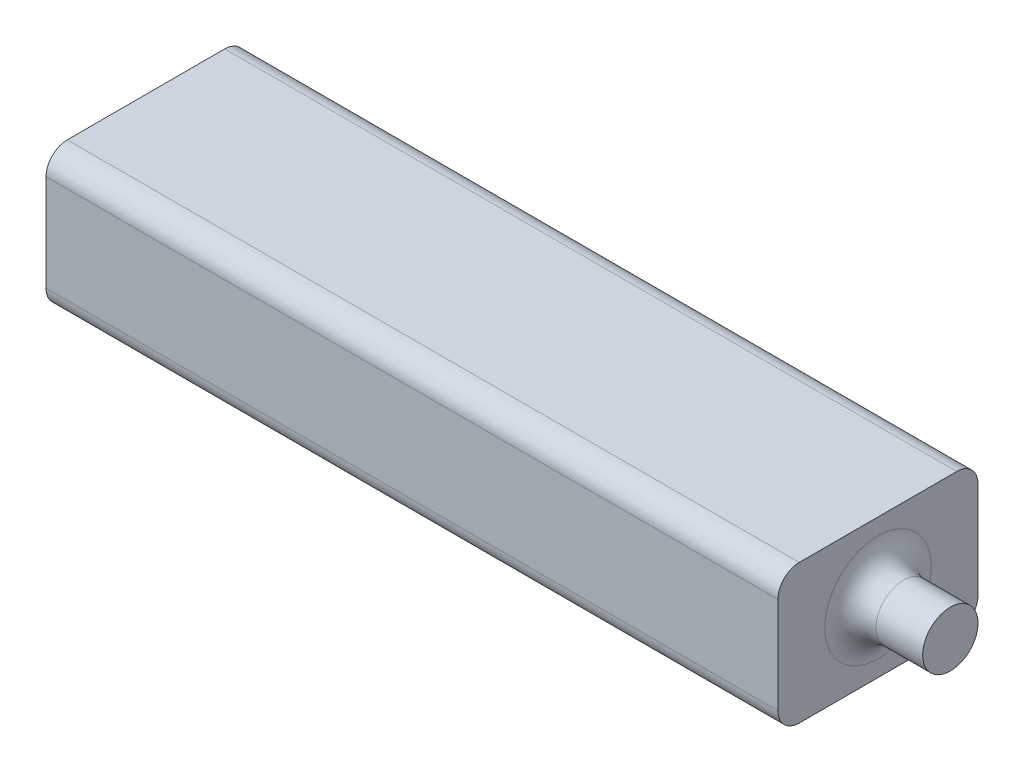
ISO-10303-21;
HEADER;
FILE_DESCRIPTION(('STEP AP214'),'2;1');
FILE_NAME('part.step','',(''),(''),'','','');
FILE_SCHEMA(('AUTOMOTIVE_DESIGN { 1 0 10303 214 1 1 1 1 }'));
ENDSEC;
DATA;
#1=APPLICATION_CONTEXT('core data for automotive mechanical design processes');
#2=APPLICATION_PROTOCOL_DEFINITION('international standard','automotive_design',2000,#1);
#3=PRODUCT_CONTEXT('',#1,'mechanical');
#4=PRODUCT('Part','Part','',(#3));
#5=PRODUCT_RELATED_PRODUCT_CATEGORY('part','',(#4));
#6=PRODUCT_DEFINITION_FORMATION('','',#4);
#7=PRODUCT_DEFINITION_CONTEXT('part definition',#1,'design');
#8=PRODUCT_DEFINITION('design','',#6,#7);
#9=PRODUCT_DEFINITION_SHAPE('','',#8);
#10=(LENGTH_UNIT() NAMED_UNIT(*) SI_UNIT(.MILLI.,.METRE.));
#11=(NAMED_UNIT(*) PLANE_ANGLE_UNIT() SI_UNIT($,.RADIAN.));
#12=(NAMED_UNIT(*) SI_UNIT($,.STERADIAN.) SOLID_ANGLE_UNIT());
#13=UNCERTAINTY_MEASURE_WITH_UNIT(LENGTH_MEASURE(1.E-05),#10,'distance_accuracy_value','');
#14=(GEOMETRIC_REPRESENTATION_CONTEXT(3) GLOBAL_UNCERTAINTY_ASSIGNED_CONTEXT((#13)) GLOBAL_UNIT_ASSIGNED_CONTEXT((#10,
#11,#12)) REPRESENTATION_CONTEXT('',''));
#15=CARTESIAN_POINT('',(0.,0.,0.));
#16=DIRECTION('',(0.,0.,1.));
#17=DIRECTION('',(1.,0.,0.));
#18=AXIS2_PLACEMENT_3D('',#15,#16,#17);
#19=CARTESIAN_POINT('',(43.,-5.675,9.25));
#20=DIRECTION('',(-1.,0.,0.));
#21=DIRECTION('',(0.,0.,1.));
#22=AXIS2_PLACEMENT_3D('',#19,#20,#21);
#23=CYLINDRICAL_SURFACE('',#22,2.5);
#24=CARTESIAN_POINT('',(-43.,-5.675,9.25));
#25=DIRECTION('',(1.,0.,0.));
#26=DIRECTION('',(0.,0.,1.));
#27=AXIS2_PLACEMENT_3D('',#24,#25,#26);
#28=CIRCLE('',#27,2.5);
#29=CARTESIAN_POINT('',(-43.,-5.675,11.75));
#30=VERTEX_POINT('',#29);
#31=CARTESIAN_POINT('',(-43.,-8.175,9.25));
#32=VERTEX_POINT('',#31);
#33=EDGE_CURVE('E276',#30,#32,#28,.T.);
#34=ORIENTED_EDGE('',*,*,#33,.T.);
#35=DIRECTION('',(-1.,0.,0.));
#36=VECTOR('',#35,1.);
#37=CARTESIAN_POINT('',(43.,-8.175,9.25));
#38=LINE('',#37,#36);
#39=CARTESIAN_POINT('',(43.,-8.175,9.25));
#40=VERTEX_POINT('',#39);
#41=EDGE_CURVE('E331',#40,#32,#38,.T.);
#42=ORIENTED_EDGE('',*,*,#41,.F.);
#43=CARTESIAN_POINT('',(43.,-5.675,9.25));
#44=DIRECTION('',(1.,0.,0.));
#45=DIRECTION('',(0.,0.,1.));
#46=AXIS2_PLACEMENT_3D('',#43,#44,#45);
#47=CIRCLE('',#46,2.5);
#48=CARTESIAN_POINT('',(43.,-5.675,11.75));
#49=VERTEX_POINT('',#48);
#50=EDGE_CURVE('E277',#49,#40,#47,.T.);
#51=ORIENTED_EDGE('',*,*,#50,.F.);
#52=DIRECTION('',(-1.,0.,0.));
#53=VECTOR('',#52,1.);
#54=CARTESIAN_POINT('',(43.,-5.675,11.75));
#55=LINE('',#54,#53);
#56=EDGE_CURVE('E295',#49,#30,#55,.T.);
#57=ORIENTED_EDGE('',*,*,#56,.T.);
#58=EDGE_LOOP('',(#34,#42,#51,#57));
#59=FACE_BOUND('',#58,.T.);
#60=ADVANCED_FACE('F36',(#59),#23,.T.);
#61=CARTESIAN_POINT('',(43.,-8.175,9.25));
#62=DIRECTION('',(0.,1.,0.));
#63=DIRECTION('',(0.,0.,1.));
#64=AXIS2_PLACEMENT_3D('',#61,#62,#63);
#65=PLANE('',#64);
#66=DIRECTION('',(0.,0.,-1.));
#67=VECTOR('',#66,1.);
#68=CARTESIAN_POINT('',(-43.,-8.175,9.25));
#69=LINE('',#68,#67);
#70=CARTESIAN_POINT('',(-43.,-8.175,-9.25));
#71=VERTEX_POINT('',#70);
#72=EDGE_CURVE('E298',#32,#71,#69,.T.);
#73=ORIENTED_EDGE('',*,*,#72,.T.);
#74=DIRECTION('',(-1.,0.,0.));
#75=VECTOR('',#74,1.);
#76=CARTESIAN_POINT('',(43.,-8.175,-9.25));
#77=LINE('',#76,#75);
#78=CARTESIAN_POINT('',(43.,-8.175,-9.25));
#79=VERTEX_POINT('',#78);
#80=EDGE_CURVE('E328',#79,#71,#77,.T.);
#81=ORIENTED_EDGE('',*,*,#80,.F.);
#82=DIRECTION('',(0.,0.,-1.));
#83=VECTOR('',#82,1.);
#84=CARTESIAN_POINT('',(43.,-8.175,9.25));
#85=LINE('',#84,#83);
#86=EDGE_CURVE('E280',#40,#79,#85,.T.);
#87=ORIENTED_EDGE('',*,*,#86,.F.);
#88=ORIENTED_EDGE('',*,*,#41,.T.);
#89=EDGE_LOOP('',(#73,#81,#87,#88));
#90=FACE_BOUND('',#89,.T.);
#91=ADVANCED_FACE('F354',(#90),#65,.F.);
#92=CARTESIAN_POINT('',(43.,-5.675,-9.25));
#93=DIRECTION('',(-1.,0.,0.));
#94=DIRECTION('',(0.,0.,1.));
#95=AXIS2_PLACEMENT_3D('',#92,#93,#94);
#96=CYLINDRICAL_SURFACE('',#95,2.5);
#97=CARTESIAN_POINT('',(-43.,-5.675,-9.25));
#98=DIRECTION('',(1.,0.,0.));
#99=DIRECTION('',(0.,0.,-1.));
#100=AXIS2_PLACEMENT_3D('',#97,#98,#99);
#101=CIRCLE('',#100,2.5);
#102=CARTESIAN_POINT('',(-43.,-5.675,-11.75));
#103=VERTEX_POINT('',#102);
#104=EDGE_CURVE('E300',#71,#103,#101,.T.);
#105=ORIENTED_EDGE('',*,*,#104,.T.);
#106=DIRECTION('',(-1.,0.,0.));
#107=VECTOR('',#106,1.);
#108=CARTESIAN_POINT('',(43.,-5.675,-11.75));
#109=LINE('',#108,#107);
#110=CARTESIAN_POINT('',(43.,-5.675,-11.75));
#111=VERTEX_POINT('',#110);
#112=EDGE_CURVE('E325',#111,#103,#109,.T.);
#113=ORIENTED_EDGE('',*,*,#112,.F.);
#114=CARTESIAN_POINT('',(43.,-5.675,-9.25));
#115=DIRECTION('',(1.,0.,0.));
#116=DIRECTION('',(0.,0.,-1.));
#117=AXIS2_PLACEMENT_3D('',#114,#115,#116);
#118=CIRCLE('',#117,2.5);
#119=EDGE_CURVE('E283',#79,#111,#118,.T.);
#120=ORIENTED_EDGE('',*,*,#119,.F.);
#121=ORIENTED_EDGE('',*,*,#80,.T.);
#122=EDGE_LOOP('',(#105,#113,#120,#121));
#123=FACE_BOUND('',#122,.T.);
#124=ADVANCED_FACE('F359',(#123),#96,.T.);
#125=CARTESIAN_POINT('',(43.,-5.675,-11.75));
#126=DIRECTION('',(0.,0.,1.));
#127=DIRECTION('',(1.,0.,0.));
#128=AXIS2_PLACEMENT_3D('',#125,#126,#127);
#129=PLANE('',#128);
#130=DIRECTION('',(-1.,0.,0.));
#131=VECTOR('',#130,1.);
#132=CARTESIAN_POINT('',(0.500000000000002,-3.925,-11.75));
#133=LINE('',#132,#131);
#134=CARTESIAN_POINT('',(0.5,-3.925,-11.75));
#135=VERTEX_POINT('',#134);
#136=CARTESIAN_POINT('',(-11.5,-3.925,-11.75));
#137=VERTEX_POINT('',#136);
#138=EDGE_CURVE('E202',#135,#137,#133,.T.);
#139=ORIENTED_EDGE('',*,*,#138,.F.);
#140=DIRECTION('',(0.,-1.,0.));
#141=VECTOR('',#140,1.);
#142=CARTESIAN_POINT('',(0.500000000000002,0.674999999999998,-11.75));
#143=LINE('',#142,#141);
#144=CARTESIAN_POINT('',(0.500000000000002,0.674999999999998,-11.75));
#145=VERTEX_POINT('',#144);
#146=EDGE_CURVE('E51',#145,#135,#143,.T.);
#147=ORIENTED_EDGE('',*,*,#146,.F.);
#148=DIRECTION('',(1.,0.,0.));
#149=VECTOR('',#148,1.);
#150=CARTESIAN_POINT('',(0.500000000000002,0.674999999999998,-11.75));
#151=LINE('',#150,#149);
#152=CARTESIAN_POINT('',(-11.5,0.675000000000001,-11.75));
#153=VERTEX_POINT('',#152);
#154=EDGE_CURVE('E193',#153,#145,#151,.T.);
#155=ORIENTED_EDGE('',*,*,#154,.F.);
#156=DIRECTION('',(0.,1.,0.));
#157=VECTOR('',#156,1.);
#158=CARTESIAN_POINT('',(-11.5,0.675000000000001,-11.75));
#159=LINE('',#158,#157);
#160=EDGE_CURVE('E196',#137,#153,#159,.T.);
#161=ORIENTED_EDGE('',*,*,#160,.F.);
#162=EDGE_LOOP('',(#139,#147,#155,#161));
#163=FACE_BOUND('',#162,.T.);
#164=DIRECTION('',(1.,0.,0.));
#165=VECTOR('',#164,1.);
#166=CARTESIAN_POINT('',(6.,0.674999999999998,-11.75));
#167=LINE('',#166,#165);
#168=CARTESIAN_POINT('',(6.00000000000001,0.674999999999999,-11.75));
#169=VERTEX_POINT('',#168);
#170=CARTESIAN_POINT('',(18.,0.674999999999997,-11.75));
#171=VERTEX_POINT('',#170);
#172=EDGE_CURVE('E228',#169,#171,#167,.T.);
#173=ORIENTED_EDGE('',*,*,#172,.F.);
#174=DIRECTION('',(0.,1.,0.));
#175=VECTOR('',#174,1.);
#176=CARTESIAN_POINT('',(6.,0.674999999999998,-11.75));
#177=LINE('',#176,#175);
#178=CARTESIAN_POINT('',(6.,-3.925,-11.75));
#179=VERTEX_POINT('',#178);
#180=EDGE_CURVE('E59',#179,#169,#177,.T.);
#181=ORIENTED_EDGE('',*,*,#180,.F.);
#182=DIRECTION('',(-1.,0.,0.));
#183=VECTOR('',#182,1.);
#184=CARTESIAN_POINT('',(6.,-3.925,-11.75));
#185=LINE('',#184,#183);
#186=CARTESIAN_POINT('',(18.,-3.925,-11.75));
#187=VERTEX_POINT('',#186);
#188=EDGE_CURVE('E217',#187,#179,#185,.T.);
#189=ORIENTED_EDGE('',*,*,#188,.F.);
#190=DIRECTION('',(0.,-1.,0.));
#191=VECTOR('',#190,1.);
#192=CARTESIAN_POINT('',(18.,0.674999999999997,-11.75));
#193=LINE('',#192,#191);
#194=EDGE_CURVE('E232',#171,#187,#193,.T.);
#195=ORIENTED_EDGE('',*,*,#194,.F.);
#196=EDGE_LOOP('',(#173,#181,#189,#195));
#197=FACE_BOUND('',#196,.T.);
#198=DIRECTION('',(1.,0.,0.));
#199=VECTOR('',#198,1.);
#200=CARTESIAN_POINT('',(23.5,0.674999999999996,-11.75));
#201=LINE('',#200,#199);
#202=CARTESIAN_POINT('',(23.5,0.674999999999997,-11.75));
#203=VERTEX_POINT('',#202);
#204=CARTESIAN_POINT('',(35.5,0.674999999999995,-11.75));
#205=VERTEX_POINT('',#204);
#206=EDGE_CURVE('E259',#203,#205,#201,.T.);
#207=ORIENTED_EDGE('',*,*,#206,.F.);
#208=DIRECTION('',(0.,1.,0.));
#209=VECTOR('',#208,1.);
#210=CARTESIAN_POINT('',(23.5,0.674999999999996,-11.75));
#211=LINE('',#210,#209);
#212=CARTESIAN_POINT('',(23.5,-3.925,-11.75));
#213=VERTEX_POINT('',#212);
#214=EDGE_CURVE('E257',#213,#203,#211,.T.);
#215=ORIENTED_EDGE('',*,*,#214,.F.);
#216=DIRECTION('',(-1.,0.,0.));
#217=VECTOR('',#216,1.);
#218=CARTESIAN_POINT('',(23.5,-3.925,-11.75));
#219=LINE('',#218,#217);
#220=CARTESIAN_POINT('',(35.5,-3.925,-11.75));
#221=VERTEX_POINT('',#220);
#222=EDGE_CURVE('E247',#221,#213,#219,.T.);
#223=ORIENTED_EDGE('',*,*,#222,.F.);
#224=DIRECTION('',(0.,-1.,0.));
#225=VECTOR('',#224,1.);
#226=CARTESIAN_POINT('',(35.5,0.674999999999995,-11.75));
#227=LINE('',#226,#225);
#228=EDGE_CURVE('E262',#205,#221,#227,.T.);
#229=ORIENTED_EDGE('',*,*,#228,.F.);
#230=EDGE_LOOP('',(#207,#215,#223,#229));
#231=FACE_BOUND('',#230,.T.);
#232=DIRECTION('',(0.,1.,0.));
#233=VECTOR('',#232,1.);
#234=CARTESIAN_POINT('',(-43.,-5.675,-11.75));
#235=LINE('',#234,#233);
#236=CARTESIAN_POINT('',(-43.,5.675,-11.75));
#237=VERTEX_POINT('',#236);
#238=EDGE_CURVE('E302',#103,#237,#235,.T.);
#239=ORIENTED_EDGE('',*,*,#238,.T.);
#240=DIRECTION('',(-1.,0.,0.));
#241=VECTOR('',#240,1.);
#242=CARTESIAN_POINT('',(43.,5.675,-11.75));
#243=LINE('',#242,#241);
#244=CARTESIAN_POINT('',(43.,5.675,-11.75));
#245=VERTEX_POINT('',#244);
#246=EDGE_CURVE('E322',#245,#237,#243,.T.);
#247=ORIENTED_EDGE('',*,*,#246,.F.);
#248=DIRECTION('',(0.,1.,0.));
#249=VECTOR('',#248,1.);
#250=CARTESIAN_POINT('',(43.,-5.675,-11.75));
#251=LINE('',#250,#249);
#252=EDGE_CURVE('E285',#111,#245,#251,.T.);
#253=ORIENTED_EDGE('',*,*,#252,.F.);
#254=ORIENTED_EDGE('',*,*,#112,.T.);
#255=EDGE_LOOP('',(#239,#247,#253,#254));
#256=FACE_BOUND('',#255,.T.);
#257=ADVANCED_FACE('F365',(#163,#197,#231,#256),#129,.F.);
#258=CARTESIAN_POINT('',(43.,5.675,-9.25));
#259=DIRECTION('',(-1.,0.,0.));
#260=DIRECTION('',(0.,0.,1.));
#261=AXIS2_PLACEMENT_3D('',#258,#259,#260);
#262=CYLINDRICAL_SURFACE('',#261,2.5);
#263=CARTESIAN_POINT('',(-43.,5.675,-9.25));
#264=DIRECTION('',(1.,0.,0.));
#265=DIRECTION('',(0.,0.,1.));
#266=AXIS2_PLACEMENT_3D('',#263,#264,#265);
#267=CIRCLE('',#266,2.5);
#268=CARTESIAN_POINT('',(-43.,8.175,-9.25));
#269=VERTEX_POINT('',#268);
#270=EDGE_CURVE('E304',#237,#269,#267,.T.);
#271=ORIENTED_EDGE('',*,*,#270,.T.);
#272=DIRECTION('',(-1.,0.,0.));
#273=VECTOR('',#272,1.);
#274=CARTESIAN_POINT('',(43.,8.175,-9.25));
#275=LINE('',#274,#273);
#276=CARTESIAN_POINT('',(43.,8.175,-9.25));
#277=VERTEX_POINT('',#276);
#278=EDGE_CURVE('E319',#277,#269,#275,.T.);
#279=ORIENTED_EDGE('',*,*,#278,.F.);
#280=CARTESIAN_POINT('',(43.,5.675,-9.25));
#281=DIRECTION('',(1.,0.,0.));
#282=DIRECTION('',(0.,0.,1.));
#283=AXIS2_PLACEMENT_3D('',#280,#281,#282);
#284=CIRCLE('',#283,2.5);
#285=EDGE_CURVE('E287',#245,#277,#284,.T.);
#286=ORIENTED_EDGE('',*,*,#285,.F.);
#287=ORIENTED_EDGE('',*,*,#246,.T.);
#288=EDGE_LOOP('',(#271,#279,#286,#287));
#289=FACE_BOUND('',#288,.T.);
#290=ADVANCED_FACE('F369',(#289),#262,.T.);
#291=CARTESIAN_POINT('',(43.,8.175,9.25));
#292=DIRECTION('',(0.,-1.,0.));
#293=DIRECTION('',(0.,0.,-1.));
#294=AXIS2_PLACEMENT_3D('',#291,#292,#293);
#295=PLANE('',#294);
#296=DIRECTION('',(0.,0.,1.));
#297=VECTOR('',#296,1.);
#298=CARTESIAN_POINT('',(-43.,8.175,9.25));
#299=LINE('',#298,#297);
#300=CARTESIAN_POINT('',(-43.,8.175,9.25));
#301=VERTEX_POINT('',#300);
#302=EDGE_CURVE('E306',#269,#301,#299,.T.);
#303=ORIENTED_EDGE('',*,*,#302,.T.);
#304=DIRECTION('',(-1.,0.,0.));
#305=VECTOR('',#304,1.);
#306=CARTESIAN_POINT('',(43.,8.175,9.25));
#307=LINE('',#306,#305);
#308=CARTESIAN_POINT('',(43.,8.175,9.25));
#309=VERTEX_POINT('',#308);
#310=EDGE_CURVE('E316',#309,#301,#307,.T.);
#311=ORIENTED_EDGE('',*,*,#310,.F.);
#312=DIRECTION('',(0.,0.,1.));
#313=VECTOR('',#312,1.);
#314=CARTESIAN_POINT('',(43.,8.175,9.25));
#315=LINE('',#314,#313);
#316=EDGE_CURVE('E289',#277,#309,#315,.T.);
#317=ORIENTED_EDGE('',*,*,#316,.F.);
#318=ORIENTED_EDGE('',*,*,#278,.T.);
#319=EDGE_LOOP('',(#303,#311,#317,#318));
#320=FACE_BOUND('',#319,.T.);
#321=ADVANCED_FACE('F373',(#320),#295,.F.);
#322=CARTESIAN_POINT('',(43.,5.675,9.25));
#323=DIRECTION('',(-1.,0.,0.));
#324=DIRECTION('',(0.,0.,1.));
#325=AXIS2_PLACEMENT_3D('',#322,#323,#324);
#326=CYLINDRICAL_SURFACE('',#325,2.5);
#327=CARTESIAN_POINT('',(-43.,5.675,9.25));
#328=DIRECTION('',(1.,0.,0.));
#329=DIRECTION('',(0.,0.,1.));
#330=AXIS2_PLACEMENT_3D('',#327,#328,#329);
#331=CIRCLE('',#330,2.5);
#332=CARTESIAN_POINT('',(-43.,5.675,11.75));
#333=VERTEX_POINT('',#332);
#334=EDGE_CURVE('E308',#301,#333,#331,.T.);
#335=ORIENTED_EDGE('',*,*,#334,.T.);
#336=DIRECTION('',(-1.,0.,0.));
#337=VECTOR('',#336,1.);
#338=CARTESIAN_POINT('',(43.,5.675,11.75));
#339=LINE('',#338,#337);
#340=CARTESIAN_POINT('',(43.,5.675,11.75));
#341=VERTEX_POINT('',#340);
#342=EDGE_CURVE('E313',#341,#333,#339,.T.);
#343=ORIENTED_EDGE('',*,*,#342,.F.);
#344=CARTESIAN_POINT('',(43.,5.675,9.25));
#345=DIRECTION('',(1.,0.,0.));
#346=DIRECTION('',(0.,0.,1.));
#347=AXIS2_PLACEMENT_3D('',#344,#345,#346);
#348=CIRCLE('',#347,2.5);
#349=EDGE_CURVE('E291',#309,#341,#348,.T.);
#350=ORIENTED_EDGE('',*,*,#349,.F.);
#351=ORIENTED_EDGE('',*,*,#310,.T.);
#352=EDGE_LOOP('',(#335,#343,#350,#351));
#353=FACE_BOUND('',#352,.T.);
#354=ADVANCED_FACE('F377',(#353),#326,.T.);
#355=CARTESIAN_POINT('',(43.,-5.675,11.75));
#356=DIRECTION('',(0.,0.,-1.));
#357=DIRECTION('',(-1.,0.,0.));
#358=AXIS2_PLACEMENT_3D('',#355,#356,#357);
#359=PLANE('',#358);
#360=DIRECTION('',(0.,-1.,0.));
#361=VECTOR('',#360,1.);
#362=CARTESIAN_POINT('',(-43.,-5.675,11.75));
#363=LINE('',#362,#361);
#364=EDGE_CURVE('E281',#333,#30,#363,.T.);
#365=ORIENTED_EDGE('',*,*,#364,.T.);
#366=ORIENTED_EDGE('',*,*,#56,.F.);
#367=DIRECTION('',(0.,-1.,0.));
#368=VECTOR('',#367,1.);
#369=CARTESIAN_POINT('',(43.,-5.675,11.75));
#370=LINE('',#369,#368);
#371=EDGE_CURVE('E293',#341,#49,#370,.T.);
#372=ORIENTED_EDGE('',*,*,#371,.F.);
#373=ORIENTED_EDGE('',*,*,#342,.T.);
#374=EDGE_LOOP('',(#365,#366,#372,#373));
#375=FACE_BOUND('',#374,.T.);
#376=ADVANCED_FACE('F381',(#375),#359,.F.);
#377=CARTESIAN_POINT('',(43.,-5.675,9.25));
#378=DIRECTION('',(-1.,0.,0.));
#379=DIRECTION('',(0.,0.,1.));
#380=AXIS2_PLACEMENT_3D('',#377,#378,#379);
#381=PLANE('',#380);
#382=CARTESIAN_POINT('',(43.,0.,0.));
#383=DIRECTION('',(-1.,0.,0.));
#384=DIRECTION('',(0.,0.,1.));
#385=AXIS2_PLACEMENT_3D('',#382,#383,#384);
#386=CIRCLE('',#385,6.25);
#387=CARTESIAN_POINT('',(43.,0.,6.25));
#388=VERTEX_POINT('',#387);
#389=EDGE_CURVE('E11',#388,#388,#386,.T.);
#390=ORIENTED_EDGE('',*,*,#389,.T.);
#391=EDGE_LOOP('',(#390));
#392=FACE_BOUND('',#391,.T.);
#393=ORIENTED_EDGE('',*,*,#50,.T.);
#394=ORIENTED_EDGE('',*,*,#86,.T.);
#395=ORIENTED_EDGE('',*,*,#119,.T.);
#396=ORIENTED_EDGE('',*,*,#252,.T.);
#397=ORIENTED_EDGE('',*,*,#285,.T.);
#398=ORIENTED_EDGE('',*,*,#316,.T.);
#399=ORIENTED_EDGE('',*,*,#349,.T.);
#400=ORIENTED_EDGE('',*,*,#371,.T.);
#401=EDGE_LOOP('',(#393,#394,#395,#396,#397,#398,#399,#400));
#402=FACE_BOUND('',#401,.T.);
#403=ADVANCED_FACE('F385',(#392,#402),#381,.F.);
#404=CARTESIAN_POINT('',(-43.,-5.675,9.25));
#405=DIRECTION('',(-1.,0.,0.));
#406=DIRECTION('',(0.,0.,1.));
#407=AXIS2_PLACEMENT_3D('',#404,#405,#406);
#408=PLANE('',#407);
#409=ORIENTED_EDGE('',*,*,#33,.F.);
#410=ORIENTED_EDGE('',*,*,#364,.F.);
#411=ORIENTED_EDGE('',*,*,#334,.F.);
#412=ORIENTED_EDGE('',*,*,#302,.F.);
#413=ORIENTED_EDGE('',*,*,#270,.F.);
#414=ORIENTED_EDGE('',*,*,#238,.F.);
#415=ORIENTED_EDGE('',*,*,#104,.F.);
#416=ORIENTED_EDGE('',*,*,#72,.F.);
#417=EDGE_LOOP('',(#409,#410,#411,#412,#413,#414,#415,#416));
#418=FACE_BOUND('',#417,.T.);
#419=ADVANCED_FACE('F387',(#418),#408,.T.);
#420=CARTESIAN_POINT('',(51.5,0.,0.));
#421=DIRECTION('',(-1.,0.,0.));
#422=DIRECTION('',(0.,0.,1.));
#423=AXIS2_PLACEMENT_3D('',#420,#421,#422);
#424=CYLINDRICAL_SURFACE('',#423,3.25);
#425=CARTESIAN_POINT('',(46.,0.,0.));
#426=DIRECTION('',(-1.,0.,0.));
#427=DIRECTION('',(0.,0.,1.));
#428=AXIS2_PLACEMENT_3D('',#425,#426,#427);
#429=CIRCLE('',#428,3.25);
#430=CARTESIAN_POINT('',(46.,0.,3.25));
#431=VERTEX_POINT('',#430);
#432=EDGE_CURVE('E44',#431,#431,#429,.F.);
#433=ORIENTED_EDGE('',*,*,#432,.T.);
#434=EDGE_LOOP('',(#433));
#435=FACE_BOUND('',#434,.T.);
#436=CARTESIAN_POINT('',(51.5,0.,0.));
#437=DIRECTION('',(1.,0.,0.));
#438=DIRECTION('',(0.,0.,-1.));
#439=AXIS2_PLACEMENT_3D('',#436,#437,#438);
#440=CIRCLE('',#439,3.25);
#441=CARTESIAN_POINT('',(51.5,0.,-3.25));
#442=VERTEX_POINT('',#441);
#443=EDGE_CURVE('E209',#442,#442,#440,.T.);
#444=ORIENTED_EDGE('',*,*,#443,.F.);
#445=EDGE_LOOP('',(#444));
#446=FACE_BOUND('',#445,.T.);
#447=ADVANCED_FACE('F336',(#435,#446),#424,.T.);
#448=CARTESIAN_POINT('',(51.5,0.,0.));
#449=DIRECTION('',(1.,0.,0.));
#450=DIRECTION('',(0.,0.,-1.));
#451=AXIS2_PLACEMENT_3D('',#448,#449,#450);
#452=PLANE('',#451);
#453=ORIENTED_EDGE('',*,*,#443,.T.);
#454=EDGE_LOOP('',(#453));
#455=FACE_BOUND('',#454,.T.);
#456=ADVANCED_FACE('F341',(#455),#452,.T.);
#457=CARTESIAN_POINT('',(46.,0.,0.));
#458=DIRECTION('',(-1.,0.,0.));
#459=DIRECTION('',(0.,0.,1.));
#460=AXIS2_PLACEMENT_3D('',#457,#458,#459);
#461=TOROIDAL_SURFACE('',#460,6.25,3.);
#462=ORIENTED_EDGE('',*,*,#389,.F.);
#463=EDGE_LOOP('',(#462));
#464=FACE_BOUND('',#463,.T.);
#465=ORIENTED_EDGE('',*,*,#432,.F.);
#466=EDGE_LOOP('',(#465));
#467=FACE_BOUND('',#466,.T.);
#468=ADVANCED_FACE('F38',(#464,#467),#461,.F.);
#469=CARTESIAN_POINT('',(23.5,0.674999999999996,-6.75));
#470=DIRECTION('',(-1.,0.,0.));
#471=DIRECTION('',(0.,0.,1.));
#472=AXIS2_PLACEMENT_3D('',#469,#470,#471);
#473=PLANE('',#472);
#474=ORIENTED_EDGE('',*,*,#214,.T.);
#475=DIRECTION('',(0.,0.,-1.));
#476=VECTOR('',#475,1.);
#477=CARTESIAN_POINT('',(23.5,0.674999999999996,-6.75));
#478=LINE('',#477,#476);
#479=CARTESIAN_POINT('',(23.5,0.674999999999996,-6.75));
#480=VERTEX_POINT('',#479);
#481=EDGE_CURVE('E256',#480,#203,#478,.T.);
#482=ORIENTED_EDGE('',*,*,#481,.F.);
#483=DIRECTION('',(0.,1.,0.));
#484=VECTOR('',#483,1.);
#485=CARTESIAN_POINT('',(23.5,0.674999999999996,-6.75));
#486=LINE('',#485,#484);
#487=CARTESIAN_POINT('',(23.5,-3.925,-6.75));
#488=VERTEX_POINT('',#487);
#489=EDGE_CURVE('E243',#488,#480,#486,.T.);
#490=ORIENTED_EDGE('',*,*,#489,.F.);
#491=DIRECTION('',(0.,0.,-1.));
#492=VECTOR('',#491,1.);
#493=CARTESIAN_POINT('',(23.5,-3.925,-6.75));
#494=LINE('',#493,#492);
#495=EDGE_CURVE('E229',#488,#213,#494,.T.);
#496=ORIENTED_EDGE('',*,*,#495,.T.);
#497=EDGE_LOOP('',(#474,#482,#490,#496));
#498=FACE_BOUND('',#497,.T.);
#499=ADVANCED_FACE('F340',(#498),#473,.F.);
#500=CARTESIAN_POINT('',(23.5,-3.925,-6.75));
#501=DIRECTION('',(0.,-1.,0.));
#502=DIRECTION('',(1.,0.,0.));
#503=AXIS2_PLACEMENT_3D('',#500,#501,#502);
#504=PLANE('',#503);
#505=ORIENTED_EDGE('',*,*,#222,.T.);
#506=ORIENTED_EDGE('',*,*,#495,.F.);
#507=DIRECTION('',(-1.,0.,0.));
#508=VECTOR('',#507,1.);
#509=CARTESIAN_POINT('',(23.5,-3.925,-6.75));
#510=LINE('',#509,#508);
#511=CARTESIAN_POINT('',(35.5,-3.925,-6.75));
#512=VERTEX_POINT('',#511);
#513=EDGE_CURVE('E253',#512,#488,#510,.T.);
#514=ORIENTED_EDGE('',*,*,#513,.F.);
#515=DIRECTION('',(0.,0.,-1.));
#516=VECTOR('',#515,1.);
#517=CARTESIAN_POINT('',(35.5,-3.925,-6.75));
#518=LINE('',#517,#516);
#519=EDGE_CURVE('E268',#512,#221,#518,.T.);
#520=ORIENTED_EDGE('',*,*,#519,.T.);
#521=EDGE_LOOP('',(#505,#506,#514,#520));
#522=FACE_BOUND('',#521,.T.);
#523=ADVANCED_FACE('F347',(#522),#504,.F.);
#524=CARTESIAN_POINT('',(35.5,0.674999999999995,-6.75));
#525=DIRECTION('',(1.,0.,0.));
#526=DIRECTION('',(0.,0.,-1.));
#527=AXIS2_PLACEMENT_3D('',#524,#525,#526);
#528=PLANE('',#527);
#529=ORIENTED_EDGE('',*,*,#228,.T.);
#530=ORIENTED_EDGE('',*,*,#519,.F.);
#531=DIRECTION('',(0.,-1.,0.));
#532=VECTOR('',#531,1.);
#533=CARTESIAN_POINT('',(35.5,0.674999999999995,-6.75));
#534=LINE('',#533,#532);
#535=CARTESIAN_POINT('',(35.5,0.674999999999995,-6.75));
#536=VERTEX_POINT('',#535);
#537=EDGE_CURVE('E250',#536,#512,#534,.T.);
#538=ORIENTED_EDGE('',*,*,#537,.F.);
#539=DIRECTION('',(0.,0.,-1.));
#540=VECTOR('',#539,1.);
#541=CARTESIAN_POINT('',(35.5,0.674999999999995,-6.75));
#542=LINE('',#541,#540);
#543=EDGE_CURVE('E270',#536,#205,#542,.T.);
#544=ORIENTED_EDGE('',*,*,#543,.T.);
#545=EDGE_LOOP('',(#529,#530,#538,#544));
#546=FACE_BOUND('',#545,.T.);
#547=ADVANCED_FACE('F400',(#546),#528,.F.);
#548=CARTESIAN_POINT('',(23.5,0.674999999999996,-6.75));
#549=DIRECTION('',(0.,1.,0.));
#550=DIRECTION('',(-1.,0.,0.));
#551=AXIS2_PLACEMENT_3D('',#548,#549,#550);
#552=PLANE('',#551);
#553=ORIENTED_EDGE('',*,*,#206,.T.);
#554=ORIENTED_EDGE('',*,*,#543,.F.);
#555=DIRECTION('',(1.,0.,0.));
#556=VECTOR('',#555,1.);
#557=CARTESIAN_POINT('',(23.5,0.674999999999996,-6.75));
#558=LINE('',#557,#556);
#559=EDGE_CURVE('E246',#480,#536,#558,.T.);
#560=ORIENTED_EDGE('',*,*,#559,.F.);
#561=ORIENTED_EDGE('',*,*,#481,.T.);
#562=EDGE_LOOP('',(#553,#554,#560,#561));
#563=FACE_BOUND('',#562,.T.);
#564=ADVANCED_FACE('F396',(#563),#552,.F.);
#565=CARTESIAN_POINT('',(0.,0.,-6.75));
#566=DIRECTION('',(0.,0.,1.));
#567=DIRECTION('',(1.,0.,0.));
#568=AXIS2_PLACEMENT_3D('',#565,#566,#567);
#569=PLANE('',#568);
#570=ORIENTED_EDGE('',*,*,#489,.T.);
#571=ORIENTED_EDGE('',*,*,#559,.T.);
#572=ORIENTED_EDGE('',*,*,#537,.T.);
#573=ORIENTED_EDGE('',*,*,#513,.T.);
#574=EDGE_LOOP('',(#570,#571,#572,#573));
#575=FACE_BOUND('',#574,.T.);
#576=ADVANCED_FACE('F399',(#575),#569,.F.);
#577=CARTESIAN_POINT('',(6.,0.674999999999998,-6.75));
#578=DIRECTION('',(-1.,0.,0.));
#579=DIRECTION('',(0.,-1.,0.));
#580=AXIS2_PLACEMENT_3D('',#577,#578,#579);
#581=PLANE('',#580);
#582=ORIENTED_EDGE('',*,*,#180,.T.);
#583=DIRECTION('',(0.,0.,-1.));
#584=VECTOR('',#583,1.);
#585=CARTESIAN_POINT('',(6.,0.674999999999998,-6.75));
#586=LINE('',#585,#584);
#587=CARTESIAN_POINT('',(6.,0.674999999999998,-6.75));
#588=VERTEX_POINT('',#587);
#589=EDGE_CURVE('E226',#588,#169,#586,.T.);
#590=ORIENTED_EDGE('',*,*,#589,.F.);
#591=DIRECTION('',(0.,1.,0.));
#592=VECTOR('',#591,1.);
#593=CARTESIAN_POINT('',(6.,0.674999999999998,-6.75));
#594=LINE('',#593,#592);
#595=CARTESIAN_POINT('',(6.,-3.925,-6.75));
#596=VERTEX_POINT('',#595);
#597=EDGE_CURVE('E213',#596,#588,#594,.T.);
#598=ORIENTED_EDGE('',*,*,#597,.F.);
#599=DIRECTION('',(0.,0.,-1.));
#600=VECTOR('',#599,1.);
#601=CARTESIAN_POINT('',(6.,-3.925,-6.75));
#602=LINE('',#601,#600);
#603=EDGE_CURVE('E203',#596,#179,#602,.T.);
#604=ORIENTED_EDGE('',*,*,#603,.T.);
#605=EDGE_LOOP('',(#582,#590,#598,#604));
#606=FACE_BOUND('',#605,.T.);
#607=ADVANCED_FACE('F410',(#606),#581,.F.);
#608=CARTESIAN_POINT('',(6.,-3.925,-6.75));
#609=DIRECTION('',(0.,-1.,0.));
#610=DIRECTION('',(1.,0.,0.));
#611=AXIS2_PLACEMENT_3D('',#608,#609,#610);
#612=PLANE('',#611);
#613=ORIENTED_EDGE('',*,*,#188,.T.);
#614=ORIENTED_EDGE('',*,*,#603,.F.);
#615=DIRECTION('',(-1.,0.,0.));
#616=VECTOR('',#615,1.);
#617=CARTESIAN_POINT('',(6.,-3.925,-6.75));
#618=LINE('',#617,#616);
#619=CARTESIAN_POINT('',(18.,-3.925,-6.75));
#620=VERTEX_POINT('',#619);
#621=EDGE_CURVE('E223',#620,#596,#618,.T.);
#622=ORIENTED_EDGE('',*,*,#621,.F.);
#623=DIRECTION('',(0.,0.,-1.));
#624=VECTOR('',#623,1.);
#625=CARTESIAN_POINT('',(18.,-3.925,-6.75));
#626=LINE('',#625,#624);
#627=EDGE_CURVE('E238',#620,#187,#626,.T.);
#628=ORIENTED_EDGE('',*,*,#627,.T.);
#629=EDGE_LOOP('',(#613,#614,#622,#628));
#630=FACE_BOUND('',#629,.T.);
#631=ADVANCED_FACE('F414',(#630),#612,.F.);
#632=CARTESIAN_POINT('',(18.,0.674999999999997,-6.75));
#633=DIRECTION('',(1.,0.,0.));
#634=DIRECTION('',(0.,0.,-1.));
#635=AXIS2_PLACEMENT_3D('',#632,#633,#634);
#636=PLANE('',#635);
#637=ORIENTED_EDGE('',*,*,#194,.T.);
#638=ORIENTED_EDGE('',*,*,#627,.F.);
#639=DIRECTION('',(0.,-1.,0.));
#640=VECTOR('',#639,1.);
#641=CARTESIAN_POINT('',(18.,0.674999999999997,-6.75));
#642=LINE('',#641,#640);
#643=CARTESIAN_POINT('',(18.,0.674999999999997,-6.75));
#644=VERTEX_POINT('',#643);
#645=EDGE_CURVE('E220',#644,#620,#642,.T.);
#646=ORIENTED_EDGE('',*,*,#645,.F.);
#647=DIRECTION('',(0.,0.,-1.));
#648=VECTOR('',#647,1.);
#649=CARTESIAN_POINT('',(18.,0.674999999999997,-6.75));
#650=LINE('',#649,#648);
#651=EDGE_CURVE('E240',#644,#171,#650,.T.);
#652=ORIENTED_EDGE('',*,*,#651,.T.);
#653=EDGE_LOOP('',(#637,#638,#646,#652));
#654=FACE_BOUND('',#653,.T.);
#655=ADVANCED_FACE('F419',(#654),#636,.F.);
#656=CARTESIAN_POINT('',(6.,0.674999999999998,-6.75));
#657=DIRECTION('',(0.,1.,0.));
#658=DIRECTION('',(-1.,0.,0.));
#659=AXIS2_PLACEMENT_3D('',#656,#657,#658);
#660=PLANE('',#659);
#661=ORIENTED_EDGE('',*,*,#172,.T.);
#662=ORIENTED_EDGE('',*,*,#651,.F.);
#663=DIRECTION('',(1.,0.,0.));
#664=VECTOR('',#663,1.);
#665=CARTESIAN_POINT('',(6.,0.674999999999998,-6.75));
#666=LINE('',#665,#664);
#667=EDGE_CURVE('E216',#588,#644,#666,.T.);
#668=ORIENTED_EDGE('',*,*,#667,.F.);
#669=ORIENTED_EDGE('',*,*,#589,.T.);
#670=EDGE_LOOP('',(#661,#662,#668,#669));
#671=FACE_BOUND('',#670,.T.);
#672=ADVANCED_FACE('F415',(#671),#660,.F.);
#673=CARTESIAN_POINT('',(0.,0.,-6.75));
#674=DIRECTION('',(0.,0.,1.));
#675=DIRECTION('',(1.,0.,0.));
#676=AXIS2_PLACEMENT_3D('',#673,#674,#675);
#677=PLANE('',#676);
#678=ORIENTED_EDGE('',*,*,#597,.T.);
#679=ORIENTED_EDGE('',*,*,#667,.T.);
#680=ORIENTED_EDGE('',*,*,#645,.T.);
#681=ORIENTED_EDGE('',*,*,#621,.T.);
#682=EDGE_LOOP('',(#678,#679,#680,#681));
#683=FACE_BOUND('',#682,.T.);
#684=ADVANCED_FACE('F418',(#683),#677,.F.);
#685=CARTESIAN_POINT('',(0.500000000000002,0.674999999999998,-6.75));
#686=DIRECTION('',(1.,0.,0.));
#687=DIRECTION('',(0.,1.,0.));
#688=AXIS2_PLACEMENT_3D('',#685,#686,#687);
#689=PLANE('',#688);
#690=ORIENTED_EDGE('',*,*,#146,.T.);
#691=DIRECTION('',(0.,0.,-1.));
#692=VECTOR('',#691,1.);
#693=CARTESIAN_POINT('',(0.500000000000002,-3.925,-6.75));
#694=LINE('',#693,#692);
#695=CARTESIAN_POINT('',(0.500000000000002,-3.925,-6.75));
#696=VERTEX_POINT('',#695);
#697=EDGE_CURVE('E171',#696,#135,#694,.T.);
#698=ORIENTED_EDGE('',*,*,#697,.F.);
#699=DIRECTION('',(0.,-1.,0.));
#700=VECTOR('',#699,1.);
#701=CARTESIAN_POINT('',(0.500000000000002,0.674999999999998,-6.75));
#702=LINE('',#701,#700);
#703=CARTESIAN_POINT('',(0.500000000000002,0.674999999999998,-6.75));
#704=VERTEX_POINT('',#703);
#705=EDGE_CURVE('E175',#704,#696,#702,.T.);
#706=ORIENTED_EDGE('',*,*,#705,.F.);
#707=DIRECTION('',(0.,0.,-1.));
#708=VECTOR('',#707,1.);
#709=CARTESIAN_POINT('',(0.500000000000002,0.674999999999998,-6.75));
#710=LINE('',#709,#708);
#711=EDGE_CURVE('E207',#704,#145,#710,.T.);
#712=ORIENTED_EDGE('',*,*,#711,.T.);
#713=EDGE_LOOP('',(#690,#698,#706,#712));
#714=FACE_BOUND('',#713,.T.);
#715=ADVANCED_FACE('F173',(#714),#689,.F.);
#716=CARTESIAN_POINT('',(0.500000000000002,0.674999999999998,-6.75));
#717=DIRECTION('',(0.,1.,0.));
#718=DIRECTION('',(-1.,0.,0.));
#719=AXIS2_PLACEMENT_3D('',#716,#717,#718);
#720=PLANE('',#719);
#721=ORIENTED_EDGE('',*,*,#154,.T.);
#722=ORIENTED_EDGE('',*,*,#711,.F.);
#723=DIRECTION('',(1.,0.,0.));
#724=VECTOR('',#723,1.);
#725=CARTESIAN_POINT('',(0.500000000000002,0.674999999999998,-6.75));
#726=LINE('',#725,#724);
#727=CARTESIAN_POINT('',(-11.5,0.675000000000001,-6.75));
#728=VERTEX_POINT('',#727);
#729=EDGE_CURVE('E181',#728,#704,#726,.T.);
#730=ORIENTED_EDGE('',*,*,#729,.F.);
#731=DIRECTION('',(0.,0.,-1.));
#732=VECTOR('',#731,1.);
#733=CARTESIAN_POINT('',(-11.5,0.675000000000001,-6.75));
#734=LINE('',#733,#732);
#735=EDGE_CURVE('E210',#728,#153,#734,.T.);
#736=ORIENTED_EDGE('',*,*,#735,.T.);
#737=EDGE_LOOP('',(#721,#722,#730,#736));
#738=FACE_BOUND('',#737,.T.);
#739=ADVANCED_FACE('F432',(#738),#720,.F.);
#740=CARTESIAN_POINT('',(-11.5,0.675000000000001,-6.75));
#741=DIRECTION('',(-1.,0.,0.));
#742=DIRECTION('',(0.,0.,1.));
#743=AXIS2_PLACEMENT_3D('',#740,#741,#742);
#744=PLANE('',#743);
#745=ORIENTED_EDGE('',*,*,#160,.T.);
#746=ORIENTED_EDGE('',*,*,#735,.F.);
#747=DIRECTION('',(0.,1.,0.));
#748=VECTOR('',#747,1.);
#749=CARTESIAN_POINT('',(-11.5,0.675000000000001,-6.75));
#750=LINE('',#749,#748);
#751=CARTESIAN_POINT('',(-11.5,-3.925,-6.75));
#752=VERTEX_POINT('',#751);
#753=EDGE_CURVE('E189',#752,#728,#750,.T.);
#754=ORIENTED_EDGE('',*,*,#753,.F.);
#755=DIRECTION('',(0.,0.,-1.));
#756=VECTOR('',#755,1.);
#757=CARTESIAN_POINT('',(-11.5,-3.925,-6.75));
#758=LINE('',#757,#756);
#759=EDGE_CURVE('E180',#752,#137,#758,.T.);
#760=ORIENTED_EDGE('',*,*,#759,.T.);
#761=EDGE_LOOP('',(#745,#746,#754,#760));
#762=FACE_BOUND('',#761,.T.);
#763=ADVANCED_FACE('F435',(#762),#744,.F.);
#764=CARTESIAN_POINT('',(0.500000000000002,-3.925,-6.75));
#765=DIRECTION('',(0.,-1.,0.));
#766=DIRECTION('',(1.,0.,0.));
#767=AXIS2_PLACEMENT_3D('',#764,#765,#766);
#768=PLANE('',#767);
#769=ORIENTED_EDGE('',*,*,#138,.T.);
#770=ORIENTED_EDGE('',*,*,#759,.F.);
#771=DIRECTION('',(-1.,0.,0.));
#772=VECTOR('',#771,1.);
#773=CARTESIAN_POINT('',(0.500000000000002,-3.925,-6.75));
#774=LINE('',#773,#772);
#775=EDGE_CURVE('E184',#696,#752,#774,.T.);
#776=ORIENTED_EDGE('',*,*,#775,.F.);
#777=ORIENTED_EDGE('',*,*,#697,.T.);
#778=EDGE_LOOP('',(#769,#770,#776,#777));
#779=FACE_BOUND('',#778,.T.);
#780=ADVANCED_FACE('F185',(#779),#768,.F.);
#781=CARTESIAN_POINT('',(0.,0.,-6.75));
#782=DIRECTION('',(0.,0.,-1.));
#783=DIRECTION('',(-1.,0.,0.));
#784=AXIS2_PLACEMENT_3D('',#781,#782,#783);
#785=PLANE('',#784);
#786=ORIENTED_EDGE('',*,*,#705,.T.);
#787=ORIENTED_EDGE('',*,*,#775,.T.);
#788=ORIENTED_EDGE('',*,*,#753,.T.);
#789=ORIENTED_EDGE('',*,*,#729,.T.);
#790=EDGE_LOOP('',(#786,#787,#788,#789));
#791=FACE_BOUND('',#790,.T.);
#792=ADVANCED_FACE('F191',(#791),#785,.T.);
#793=CLOSED_SHELL('',(#60,#91,#124,#257,#290,#321,#354,#376,#403,#419,#447,#456,#468,#499,#523,
#547,#564,#576,#607,#631,#655,#672,#684,#715,#739,#763,#780,#792));
#794=MANIFOLD_SOLID_BREP('B2',#793);
#795=ADVANCED_BREP_SHAPE_REPRESENTATION('',(#18,#794),#14);
#796=SHAPE_DEFINITION_REPRESENTATION(#9,#795);
ENDSEC;
END-ISO-10303-21;
